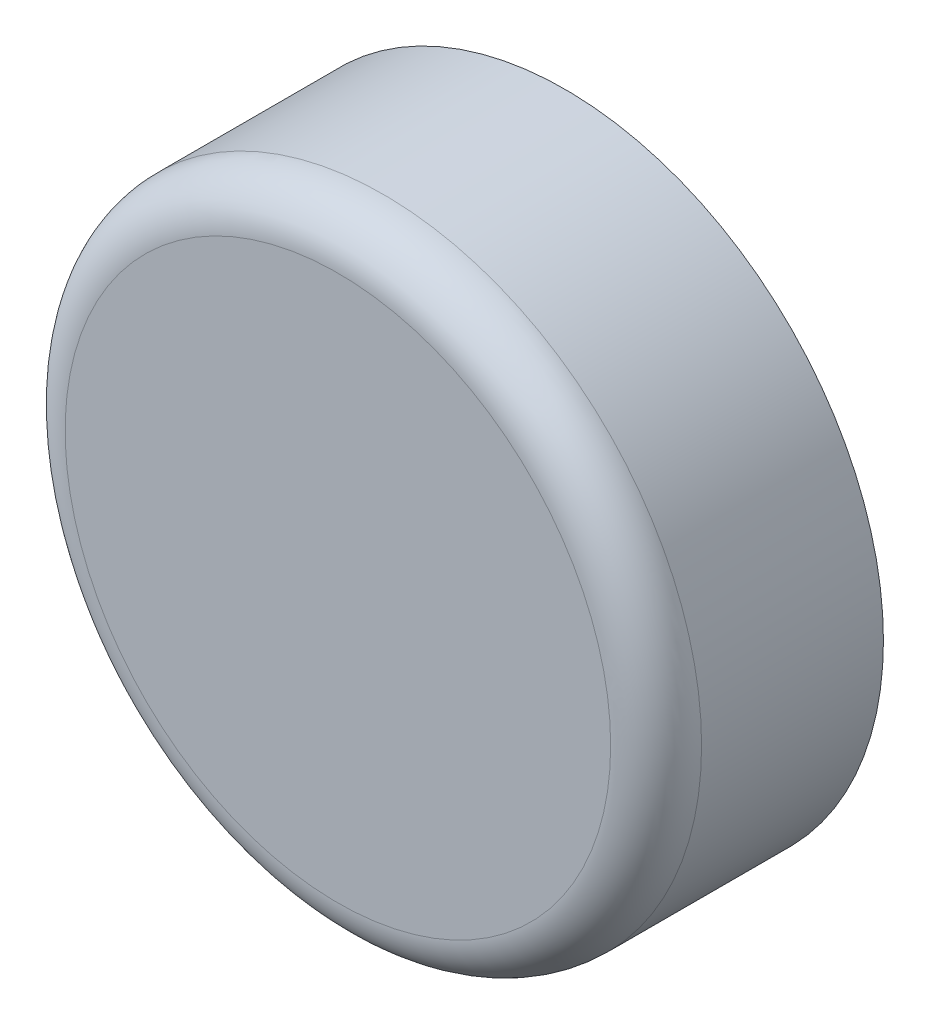
ISO-10303-21;
HEADER;
FILE_DESCRIPTION(('STEP AP214'),'2;1');
FILE_NAME('part.step','',(''),(''),'','','');
FILE_SCHEMA(('AUTOMOTIVE_DESIGN { 1 0 10303 214 1 1 1 1 }'));
ENDSEC;
DATA;
#1=APPLICATION_CONTEXT('core data for automotive mechanical design processes');
#2=APPLICATION_PROTOCOL_DEFINITION('international standard','automotive_design',2000,#1);
#3=PRODUCT_CONTEXT('',#1,'mechanical');
#4=PRODUCT('Part','Part','',(#3));
#5=PRODUCT_RELATED_PRODUCT_CATEGORY('part','',(#4));
#6=PRODUCT_DEFINITION_FORMATION('','',#4);
#7=PRODUCT_DEFINITION_CONTEXT('part definition',#1,'design');
#8=PRODUCT_DEFINITION('design','',#6,#7);
#9=PRODUCT_DEFINITION_SHAPE('','',#8);
#10=(LENGTH_UNIT() NAMED_UNIT(*) SI_UNIT(.MILLI.,.METRE.));
#11=(NAMED_UNIT(*) PLANE_ANGLE_UNIT() SI_UNIT($,.RADIAN.));
#12=(NAMED_UNIT(*) SI_UNIT($,.STERADIAN.) SOLID_ANGLE_UNIT());
#13=UNCERTAINTY_MEASURE_WITH_UNIT(LENGTH_MEASURE(1.E-05),#10,'distance_accuracy_value','');
#14=(GEOMETRIC_REPRESENTATION_CONTEXT(3) GLOBAL_UNCERTAINTY_ASSIGNED_CONTEXT((#13)) GLOBAL_UNIT_ASSIGNED_CONTEXT((#10,
#11,#12)) REPRESENTATION_CONTEXT('',''));
#15=CARTESIAN_POINT('',(0.,0.,0.));
#16=DIRECTION('',(0.,0.,1.));
#17=DIRECTION('',(1.,0.,0.));
#18=AXIS2_PLACEMENT_3D('',#15,#16,#17);
#19=CARTESIAN_POINT('',(0.,0.,10.));
#20=DIRECTION('',(0.,0.,-1.));
#21=DIRECTION('',(-1.,0.,0.));
#22=AXIS2_PLACEMENT_3D('',#19,#20,#21);
#23=CYLINDRICAL_SURFACE('',#22,14.);
#24=CARTESIAN_POINT('',(0.,0.,8.));
#25=DIRECTION('',(0.,0.,1.));
#26=DIRECTION('',(1.,0.,0.));
#27=AXIS2_PLACEMENT_3D('',#24,#25,#26);
#28=CIRCLE('',#27,14.);
#29=CARTESIAN_POINT('',(14.,0.,8.));
#30=VERTEX_POINT('',#29);
#31=EDGE_CURVE('E10',#30,#30,#28,.F.);
#32=ORIENTED_EDGE('',*,*,#31,.T.);
#33=EDGE_LOOP('',(#32));
#34=FACE_BOUND('',#33,.T.);
#35=CARTESIAN_POINT('',(0.,0.,0.));
#36=DIRECTION('',(0.,0.,1.));
#37=DIRECTION('',(1.,0.,0.));
#38=AXIS2_PLACEMENT_3D('',#35,#36,#37);
#39=CIRCLE('',#38,14.);
#40=CARTESIAN_POINT('',(14.,0.,0.));
#41=VERTEX_POINT('',#40);
#42=EDGE_CURVE('E47',#41,#41,#39,.T.);
#43=ORIENTED_EDGE('',*,*,#42,.T.);
#44=EDGE_LOOP('',(#43));
#45=FACE_BOUND('',#44,.T.);
#46=ADVANCED_FACE('F36',(#34,#45),#23,.T.);
#47=CARTESIAN_POINT('',(0.,0.,10.));
#48=DIRECTION('',(0.,0.,1.));
#49=DIRECTION('',(1.,0.,0.));
#50=AXIS2_PLACEMENT_3D('',#47,#48,#49);
#51=PLANE('',#50);
#52=CARTESIAN_POINT('',(0.,0.,10.));
#53=DIRECTION('',(0.,0.,1.));
#54=DIRECTION('',(1.,0.,0.));
#55=AXIS2_PLACEMENT_3D('',#52,#53,#54);
#56=CIRCLE('',#55,12.);
#57=CARTESIAN_POINT('',(12.,0.,10.));
#58=VERTEX_POINT('',#57);
#59=EDGE_CURVE('E43',#58,#58,#56,.T.);
#60=ORIENTED_EDGE('',*,*,#59,.T.);
#61=EDGE_LOOP('',(#60));
#62=FACE_BOUND('',#61,.T.);
#63=ADVANCED_FACE('F57',(#62),#51,.T.);
#64=CARTESIAN_POINT('',(0.,0.,0.));
#65=DIRECTION('',(0.,0.,1.));
#66=DIRECTION('',(1.,0.,0.));
#67=AXIS2_PLACEMENT_3D('',#64,#65,#66);
#68=PLANE('',#67);
#69=ORIENTED_EDGE('',*,*,#42,.F.);
#70=EDGE_LOOP('',(#69));
#71=FACE_BOUND('',#70,.T.);
#72=ADVANCED_FACE('F55',(#71),#68,.F.);
#73=CARTESIAN_POINT('',(0.,0.,8.));
#74=DIRECTION('',(0.,0.,1.));
#75=DIRECTION('',(1.,0.,0.));
#76=AXIS2_PLACEMENT_3D('',#73,#74,#75);
#77=TOROIDAL_SURFACE('',#76,12.,2.);
#78=ORIENTED_EDGE('',*,*,#31,.F.);
#79=EDGE_LOOP('',(#78));
#80=FACE_BOUND('',#79,.T.);
#81=ORIENTED_EDGE('',*,*,#59,.F.);
#82=EDGE_LOOP('',(#81));
#83=FACE_BOUND('',#82,.T.);
#84=ADVANCED_FACE('F38',(#80,#83),#77,.T.);
#85=CLOSED_SHELL('',(#46,#63,#72,#84));
#86=MANIFOLD_SOLID_BREP('B2',#85);
#87=ADVANCED_BREP_SHAPE_REPRESENTATION('',(#18,#86),#14);
#88=SHAPE_DEFINITION_REPRESENTATION(#9,#87);
ENDSEC;
END-ISO-10303-21;
